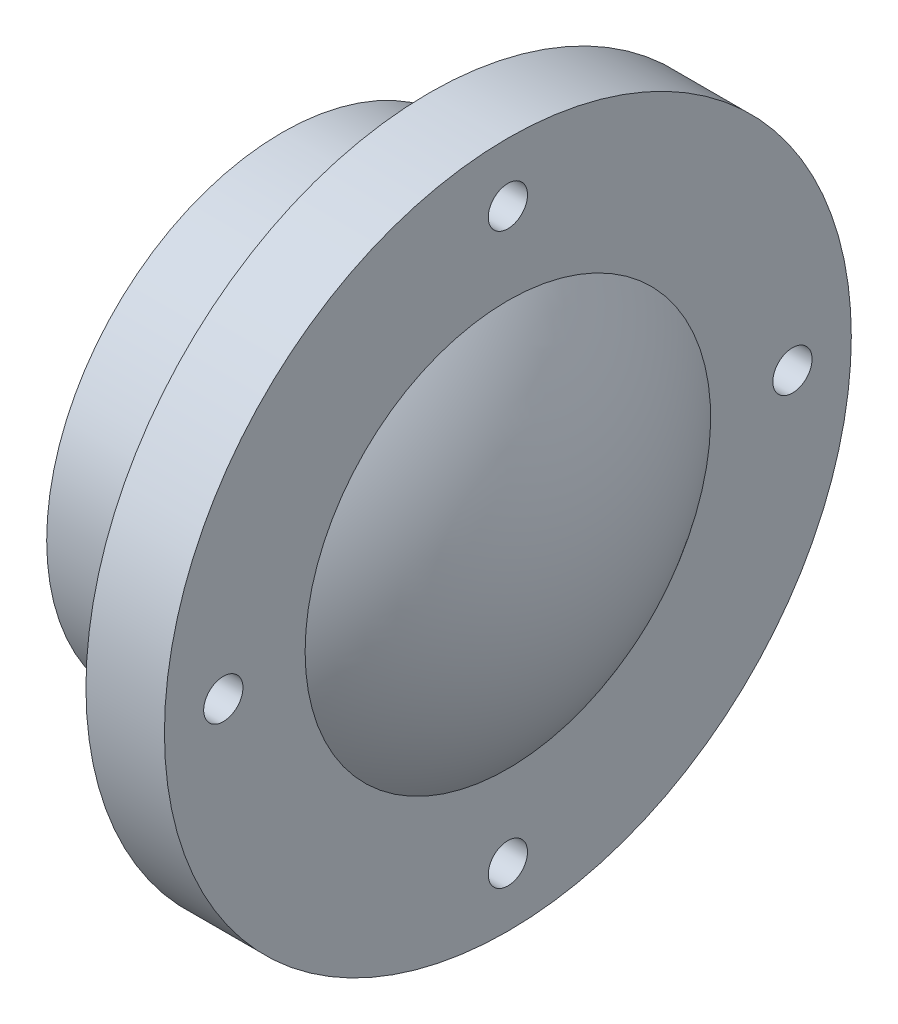
ISO-10303-21;
HEADER;
FILE_DESCRIPTION(('STEP AP214'),'2;1');
FILE_NAME('part.step','',(''),(''),'','','');
FILE_SCHEMA(('AUTOMOTIVE_DESIGN { 1 0 10303 214 1 1 1 1 }'));
ENDSEC;
DATA;
#1=APPLICATION_CONTEXT('core data for automotive mechanical design processes');
#2=APPLICATION_PROTOCOL_DEFINITION('international standard','automotive_design',2000,#1);
#3=PRODUCT_CONTEXT('',#1,'mechanical');
#4=PRODUCT('Part','Part','',(#3));
#5=PRODUCT_RELATED_PRODUCT_CATEGORY('part','',(#4));
#6=PRODUCT_DEFINITION_FORMATION('','',#4);
#7=PRODUCT_DEFINITION_CONTEXT('part definition',#1,'design');
#8=PRODUCT_DEFINITION('design','',#6,#7);
#9=PRODUCT_DEFINITION_SHAPE('','',#8);
#10=(LENGTH_UNIT() NAMED_UNIT(*) SI_UNIT(.MILLI.,.METRE.));
#11=(NAMED_UNIT(*) PLANE_ANGLE_UNIT() SI_UNIT($,.RADIAN.));
#12=(NAMED_UNIT(*) SI_UNIT($,.STERADIAN.) SOLID_ANGLE_UNIT());
#13=UNCERTAINTY_MEASURE_WITH_UNIT(LENGTH_MEASURE(1.E-05),#10,'distance_accuracy_value','');
#14=(GEOMETRIC_REPRESENTATION_CONTEXT(3) GLOBAL_UNCERTAINTY_ASSIGNED_CONTEXT((#13)) GLOBAL_UNIT_ASSIGNED_CONTEXT((#10,
#11,#12)) REPRESENTATION_CONTEXT('',''));
#15=CARTESIAN_POINT('',(0.,0.,0.));
#16=DIRECTION('',(0.,0.,1.));
#17=DIRECTION('',(1.,0.,0.));
#18=AXIS2_PLACEMENT_3D('',#15,#16,#17);
#19=CARTESIAN_POINT('',(15.,24.,0.));
#20=DIRECTION('',(1.,0.,0.));
#21=DIRECTION('',(0.,0.,-1.));
#22=AXIS2_PLACEMENT_3D('',#19,#20,#21);
#23=PLANE('',#22);
#24=CARTESIAN_POINT('',(15.,0.,0.));
#25=DIRECTION('',(-1.,0.,0.));
#26=DIRECTION('',(0.,0.,1.));
#27=AXIS2_PLACEMENT_3D('',#24,#25,#26);
#28=CIRCLE('',#27,24.);
#29=CARTESIAN_POINT('',(15.,0.,24.));
#30=VERTEX_POINT('',#29);
#31=EDGE_CURVE('E92',#30,#30,#28,.T.);
#32=ORIENTED_EDGE('',*,*,#31,.F.);
#33=EDGE_LOOP('',(#32));
#34=FACE_BOUND('',#33,.T.);
#35=CARTESIAN_POINT('',(15.,0.,0.));
#36=DIRECTION('',(-1.,0.,0.));
#37=DIRECTION('',(0.,0.,1.));
#38=AXIS2_PLACEMENT_3D('',#35,#36,#37);
#39=CIRCLE('',#38,35.);
#40=CARTESIAN_POINT('',(15.,0.,35.));
#41=VERTEX_POINT('',#40);
#42=EDGE_CURVE('E11',#41,#41,#39,.T.);
#43=ORIENTED_EDGE('',*,*,#42,.T.);
#44=EDGE_LOOP('',(#43));
#45=FACE_BOUND('',#44,.T.);
#46=ADVANCED_FACE('F39',(#34,#45),#23,.F.);
#47=CARTESIAN_POINT('',(0.,0.,0.));
#48=DIRECTION('',(-1.,0.,0.));
#49=DIRECTION('',(0.,0.,1.));
#50=AXIS2_PLACEMENT_3D('',#47,#48,#49);
#51=CYLINDRICAL_SURFACE('',#50,35.);
#52=ORIENTED_EDGE('',*,*,#42,.F.);
#53=EDGE_LOOP('',(#52));
#54=FACE_BOUND('',#53,.T.);
#55=CARTESIAN_POINT('',(23.,0.,0.));
#56=DIRECTION('',(-1.,0.,0.));
#57=DIRECTION('',(0.,0.,1.));
#58=AXIS2_PLACEMENT_3D('',#55,#56,#57);
#59=CIRCLE('',#58,35.);
#60=CARTESIAN_POINT('',(23.,0.,35.));
#61=VERTEX_POINT('',#60);
#62=EDGE_CURVE('E46',#61,#61,#59,.T.);
#63=ORIENTED_EDGE('',*,*,#62,.T.);
#64=EDGE_LOOP('',(#63));
#65=FACE_BOUND('',#64,.T.);
#66=ADVANCED_FACE('F109',(#54,#65),#51,.T.);
#67=CARTESIAN_POINT('',(23.,35.,0.));
#68=DIRECTION('',(-1.,0.,0.));
#69=DIRECTION('',(0.,0.,1.));
#70=AXIS2_PLACEMENT_3D('',#67,#68,#69);
#71=PLANE('',#70);
#72=CARTESIAN_POINT('',(23.,0.,-29.));
#73=DIRECTION('',(1.,0.,0.));
#74=DIRECTION('',(0.,0.,-1.));
#75=AXIS2_PLACEMENT_3D('',#72,#73,#74);
#76=CIRCLE('',#75,1.99999999999999);
#77=CARTESIAN_POINT('',(23.,0.,-31.));
#78=VERTEX_POINT('',#77);
#79=EDGE_CURVE('E70',#78,#78,#76,.T.);
#80=ORIENTED_EDGE('',*,*,#79,.F.);
#81=EDGE_LOOP('',(#80));
#82=FACE_BOUND('',#81,.T.);
#83=CARTESIAN_POINT('',(23.,-29.,1.01252958826451E-13));
#84=DIRECTION('',(1.,0.,0.));
#85=DIRECTION('',(0.,0.,-1.));
#86=AXIS2_PLACEMENT_3D('',#83,#84,#85);
#87=CIRCLE('',#86,1.99999999999999);
#88=CARTESIAN_POINT('',(23.,-29.,-1.99999999999989));
#89=VERTEX_POINT('',#88);
#90=EDGE_CURVE('E69',#89,#89,#87,.T.);
#91=ORIENTED_EDGE('',*,*,#90,.F.);
#92=EDGE_LOOP('',(#91));
#93=FACE_BOUND('',#92,.T.);
#94=CARTESIAN_POINT('',(23.,2.02505917652902E-13,29.));
#95=DIRECTION('',(1.,0.,0.));
#96=DIRECTION('',(0.,0.,-1.));
#97=AXIS2_PLACEMENT_3D('',#94,#95,#96);
#98=CIRCLE('',#97,1.99999999999999);
#99=CARTESIAN_POINT('',(23.,2.02505917652902E-13,27.));
#100=VERTEX_POINT('',#99);
#101=EDGE_CURVE('E80',#100,#100,#98,.T.);
#102=ORIENTED_EDGE('',*,*,#101,.F.);
#103=EDGE_LOOP('',(#102));
#104=FACE_BOUND('',#103,.T.);
#105=CARTESIAN_POINT('',(23.,29.,-3.03758876479353E-13));
#106=DIRECTION('',(1.,0.,0.));
#107=DIRECTION('',(0.,0.,-1.));
#108=AXIS2_PLACEMENT_3D('',#105,#106,#107);
#109=CIRCLE('',#108,1.99999999999999);
#110=CARTESIAN_POINT('',(23.,29.,-2.00000000000029));
#111=VERTEX_POINT('',#110);
#112=EDGE_CURVE('E86',#111,#111,#109,.T.);
#113=ORIENTED_EDGE('',*,*,#112,.F.);
#114=EDGE_LOOP('',(#113));
#115=FACE_BOUND('',#114,.T.);
#116=ORIENTED_EDGE('',*,*,#62,.F.);
#117=EDGE_LOOP('',(#116));
#118=FACE_BOUND('',#117,.T.);
#119=CARTESIAN_POINT('',(23.,0.,0.));
#120=DIRECTION('',(-1.,0.,0.));
#121=DIRECTION('',(0.,0.,1.));
#122=AXIS2_PLACEMENT_3D('',#119,#120,#121);
#123=CIRCLE('',#122,20.6639783197718);
#124=CARTESIAN_POINT('',(23.,0.,20.6639783197718));
#125=VERTEX_POINT('',#124);
#126=EDGE_CURVE('E104',#125,#125,#123,.T.);
#127=ORIENTED_EDGE('',*,*,#126,.T.);
#128=EDGE_LOOP('',(#127));
#129=FACE_BOUND('',#128,.T.);
#130=ADVANCED_FACE('F111',(#82,#93,#104,#115,#118,#129),#71,.F.);
#131=CARTESIAN_POINT('',(-4.,0.,0.));
#132=DIRECTION('',(-1.,0.,0.));
#133=DIRECTION('',(0.,1.,0.));
#134=AXIS2_PLACEMENT_3D('',#131,#132,#133);
#135=SPHERICAL_SURFACE('',#134,34.);
#136=ORIENTED_EDGE('',*,*,#126,.F.);
#137=EDGE_LOOP('',(#136));
#138=FACE_BOUND('',#137,.T.);
#139=ADVANCED_FACE('F114',(#138),#135,.T.);
#140=CARTESIAN_POINT('',(-4.,0.,0.));
#141=DIRECTION('',(-1.,0.,0.));
#142=DIRECTION('',(0.,1.,0.));
#143=AXIS2_PLACEMENT_3D('',#140,#141,#142);
#144=SPHERICAL_SURFACE('',#143,28.);
#145=CARTESIAN_POINT('',(18.0553281544392,0.,0.));
#146=DIRECTION('',(-1.,0.,0.));
#147=DIRECTION('',(0.,0.,1.));
#148=AXIS2_PLACEMENT_3D('',#145,#146,#147);
#149=CIRCLE('',#148,17.25);
#150=CARTESIAN_POINT('',(18.0553281544392,0.,17.25));
#151=VERTEX_POINT('',#150);
#152=EDGE_CURVE('E101',#151,#151,#149,.T.);
#153=ORIENTED_EDGE('',*,*,#152,.T.);
#154=EDGE_LOOP('',(#153));
#155=FACE_BOUND('',#154,.T.);
#156=ADVANCED_FACE('F120',(#155),#144,.F.);
#157=CARTESIAN_POINT('',(0.,0.,0.));
#158=DIRECTION('',(-1.,0.,0.));
#159=DIRECTION('',(0.,0.,1.));
#160=AXIS2_PLACEMENT_3D('',#157,#158,#159);
#161=CYLINDRICAL_SURFACE('',#160,17.25);
#162=ORIENTED_EDGE('',*,*,#152,.F.);
#163=EDGE_LOOP('',(#162));
#164=FACE_BOUND('',#163,.T.);
#165=CARTESIAN_POINT('',(0.,0.,0.));
#166=DIRECTION('',(-1.,0.,0.));
#167=DIRECTION('',(0.,0.,1.));
#168=AXIS2_PLACEMENT_3D('',#165,#166,#167);
#169=CIRCLE('',#168,17.25);
#170=CARTESIAN_POINT('',(0.,0.,17.25));
#171=VERTEX_POINT('',#170);
#172=EDGE_CURVE('E98',#171,#171,#169,.T.);
#173=ORIENTED_EDGE('',*,*,#172,.T.);
#174=EDGE_LOOP('',(#173));
#175=FACE_BOUND('',#174,.T.);
#176=ADVANCED_FACE('F126',(#164,#175),#161,.F.);
#177=CARTESIAN_POINT('',(0.,17.25,0.));
#178=DIRECTION('',(1.,0.,0.));
#179=DIRECTION('',(0.,0.,-1.));
#180=AXIS2_PLACEMENT_3D('',#177,#178,#179);
#181=PLANE('',#180);
#182=ORIENTED_EDGE('',*,*,#172,.F.);
#183=EDGE_LOOP('',(#182));
#184=FACE_BOUND('',#183,.T.);
#185=CARTESIAN_POINT('',(0.,0.,0.));
#186=DIRECTION('',(-1.,0.,0.));
#187=DIRECTION('',(0.,0.,1.));
#188=AXIS2_PLACEMENT_3D('',#185,#186,#187);
#189=CIRCLE('',#188,24.);
#190=CARTESIAN_POINT('',(0.,0.,24.));
#191=VERTEX_POINT('',#190);
#192=EDGE_CURVE('E95',#191,#191,#189,.T.);
#193=ORIENTED_EDGE('',*,*,#192,.T.);
#194=EDGE_LOOP('',(#193));
#195=FACE_BOUND('',#194,.T.);
#196=ADVANCED_FACE('F141',(#184,#195),#181,.F.);
#197=CARTESIAN_POINT('',(0.,0.,0.));
#198=DIRECTION('',(-1.,0.,0.));
#199=DIRECTION('',(0.,0.,1.));
#200=AXIS2_PLACEMENT_3D('',#197,#198,#199);
#201=CYLINDRICAL_SURFACE('',#200,24.);
#202=ORIENTED_EDGE('',*,*,#192,.F.);
#203=EDGE_LOOP('',(#202));
#204=FACE_BOUND('',#203,.T.);
#205=ORIENTED_EDGE('',*,*,#31,.T.);
#206=EDGE_LOOP('',(#205));
#207=FACE_BOUND('',#206,.T.);
#208=ADVANCED_FACE('F138',(#204,#207),#201,.T.);
#209=CARTESIAN_POINT('',(19.2017212380551,29.,-3.03758876479353E-13));
#210=DIRECTION('',(1.,0.,0.));
#211=DIRECTION('',(0.,0.,-1.));
#212=AXIS2_PLACEMENT_3D('',#209,#210,#211);
#213=CONICAL_SURFACE('',#212,2.,1.02974425867665);
#214=CARTESIAN_POINT('',(18.,29.,-3.03758876479353E-13));
#215=VERTEX_POINT('',#214);
#216=VERTEX_LOOP('',#215);
#217=FACE_BOUND('',#216,.T.);
#218=CARTESIAN_POINT('',(19.2017212380551,29.,-3.03758876479353E-13));
#219=DIRECTION('',(1.,0.,0.));
#220=DIRECTION('',(0.,0.,-1.));
#221=AXIS2_PLACEMENT_3D('',#218,#219,#220);
#222=CIRCLE('',#221,2.);
#223=CARTESIAN_POINT('',(19.2017212380551,29.,-2.0000000000003));
#224=VERTEX_POINT('',#223);
#225=EDGE_CURVE('E89',#224,#224,#222,.T.);
#226=ORIENTED_EDGE('',*,*,#225,.T.);
#227=EDGE_LOOP('',(#226));
#228=FACE_BOUND('',#227,.T.);
#229=ADVANCED_FACE('F140',(#217,#228),#213,.F.);
#230=CARTESIAN_POINT('',(23.,29.,-3.03758876479353E-13));
#231=DIRECTION('',(1.,0.,0.));
#232=DIRECTION('',(0.,0.,-1.));
#233=AXIS2_PLACEMENT_3D('',#230,#231,#232);
#234=CYLINDRICAL_SURFACE('',#233,1.99999999999999);
#235=ORIENTED_EDGE('',*,*,#225,.F.);
#236=EDGE_LOOP('',(#235));
#237=FACE_BOUND('',#236,.T.);
#238=ORIENTED_EDGE('',*,*,#112,.T.);
#239=EDGE_LOOP('',(#238));
#240=FACE_BOUND('',#239,.T.);
#241=ADVANCED_FACE('F148',(#237,#240),#234,.F.);
#242=CARTESIAN_POINT('',(19.2017212380551,2.02505917652902E-13,29.));
#243=DIRECTION('',(1.,0.,0.));
#244=DIRECTION('',(0.,0.,-1.));
#245=AXIS2_PLACEMENT_3D('',#242,#243,#244);
#246=CONICAL_SURFACE('',#245,2.,1.02974425867665);
#247=CARTESIAN_POINT('',(18.,2.01204875045919E-13,29.));
#248=VERTEX_POINT('',#247);
#249=VERTEX_LOOP('',#248);
#250=FACE_BOUND('',#249,.T.);
#251=CARTESIAN_POINT('',(19.2017212380551,2.02505917652902E-13,29.));
#252=DIRECTION('',(1.,0.,0.));
#253=DIRECTION('',(0.,0.,-1.));
#254=AXIS2_PLACEMENT_3D('',#251,#252,#253);
#255=CIRCLE('',#254,2.);
#256=CARTESIAN_POINT('',(19.2017212380551,2.02505917652902E-13,27.));
#257=VERTEX_POINT('',#256);
#258=EDGE_CURVE('E83',#257,#257,#255,.T.);
#259=ORIENTED_EDGE('',*,*,#258,.T.);
#260=EDGE_LOOP('',(#259));
#261=FACE_BOUND('',#260,.T.);
#262=ADVANCED_FACE('F190',(#250,#261),#246,.F.);
#263=CARTESIAN_POINT('',(23.,2.02505917652902E-13,29.));
#264=DIRECTION('',(1.,0.,0.));
#265=DIRECTION('',(0.,0.,-1.));
#266=AXIS2_PLACEMENT_3D('',#263,#264,#265);
#267=CYLINDRICAL_SURFACE('',#266,1.99999999999999);
#268=ORIENTED_EDGE('',*,*,#258,.F.);
#269=EDGE_LOOP('',(#268));
#270=FACE_BOUND('',#269,.T.);
#271=ORIENTED_EDGE('',*,*,#101,.T.);
#272=EDGE_LOOP('',(#271));
#273=FACE_BOUND('',#272,.T.);
#274=ADVANCED_FACE('F199',(#270,#273),#267,.F.);
#275=CARTESIAN_POINT('',(19.2017212380551,-29.,1.01252958826451E-13));
#276=DIRECTION('',(1.,0.,0.));
#277=DIRECTION('',(0.,0.,-1.));
#278=AXIS2_PLACEMENT_3D('',#275,#276,#277);
#279=CONICAL_SURFACE('',#278,2.,1.02974425867665);
#280=CARTESIAN_POINT('',(18.,-29.,1.01252958826451E-13));
#281=VERTEX_POINT('',#280);
#282=VERTEX_LOOP('',#281);
#283=FACE_BOUND('',#282,.T.);
#284=CARTESIAN_POINT('',(19.2017212380551,-29.,1.01252958826451E-13));
#285=DIRECTION('',(1.,0.,0.));
#286=DIRECTION('',(0.,0.,-1.));
#287=AXIS2_PLACEMENT_3D('',#284,#285,#286);
#288=CIRCLE('',#287,2.);
#289=CARTESIAN_POINT('',(19.2017212380551,-29.,-1.9999999999999));
#290=VERTEX_POINT('',#289);
#291=EDGE_CURVE('E73',#290,#290,#288,.T.);
#292=ORIENTED_EDGE('',*,*,#291,.T.);
#293=EDGE_LOOP('',(#292));
#294=FACE_BOUND('',#293,.T.);
#295=ADVANCED_FACE('F208',(#283,#294),#279,.F.);
#296=CARTESIAN_POINT('',(23.,-29.,1.01252958826451E-13));
#297=DIRECTION('',(1.,0.,0.));
#298=DIRECTION('',(0.,0.,-1.));
#299=AXIS2_PLACEMENT_3D('',#296,#297,#298);
#300=CYLINDRICAL_SURFACE('',#299,1.99999999999999);
#301=ORIENTED_EDGE('',*,*,#291,.F.);
#302=EDGE_LOOP('',(#301));
#303=FACE_BOUND('',#302,.T.);
#304=ORIENTED_EDGE('',*,*,#90,.T.);
#305=EDGE_LOOP('',(#304));
#306=FACE_BOUND('',#305,.T.);
#307=ADVANCED_FACE('F63',(#303,#306),#300,.F.);
#308=CARTESIAN_POINT('',(19.2017212380551,0.,-29.));
#309=DIRECTION('',(1.,0.,0.));
#310=DIRECTION('',(0.,0.,-1.));
#311=AXIS2_PLACEMENT_3D('',#308,#309,#310);
#312=CONICAL_SURFACE('',#311,2.,1.02974425867665);
#313=CARTESIAN_POINT('',(18.,0.,-29.));
#314=VERTEX_POINT('',#313);
#315=VERTEX_LOOP('',#314);
#316=FACE_BOUND('',#315,.T.);
#317=CARTESIAN_POINT('',(19.2017212380551,0.,-29.));
#318=DIRECTION('',(1.,0.,0.));
#319=DIRECTION('',(0.,0.,-1.));
#320=AXIS2_PLACEMENT_3D('',#317,#318,#319);
#321=CIRCLE('',#320,2.);
#322=CARTESIAN_POINT('',(19.2017212380551,0.,-31.));
#323=VERTEX_POINT('',#322);
#324=EDGE_CURVE('E67',#323,#323,#321,.T.);
#325=ORIENTED_EDGE('',*,*,#324,.T.);
#326=EDGE_LOOP('',(#325));
#327=FACE_BOUND('',#326,.T.);
#328=ADVANCED_FACE('F59',(#316,#327),#312,.F.);
#329=CARTESIAN_POINT('',(23.,0.,-29.));
#330=DIRECTION('',(1.,0.,0.));
#331=DIRECTION('',(0.,0.,-1.));
#332=AXIS2_PLACEMENT_3D('',#329,#330,#331);
#333=CYLINDRICAL_SURFACE('',#332,1.99999999999999);
#334=ORIENTED_EDGE('',*,*,#324,.F.);
#335=EDGE_LOOP('',(#334));
#336=FACE_BOUND('',#335,.T.);
#337=ORIENTED_EDGE('',*,*,#79,.T.);
#338=EDGE_LOOP('',(#337));
#339=FACE_BOUND('',#338,.T.);
#340=ADVANCED_FACE('F62',(#336,#339),#333,.F.);
#341=CLOSED_SHELL('',(#46,#66,#130,#139,#156,#176,#196,#208,#229,#241,#262,#274,#295,#307,#328,#340));
#342=MANIFOLD_SOLID_BREP('B2',#341);
#343=ADVANCED_BREP_SHAPE_REPRESENTATION('',(#18,#342),#14);
#344=SHAPE_DEFINITION_REPRESENTATION(#9,#343);
ENDSEC;
END-ISO-10303-21;
